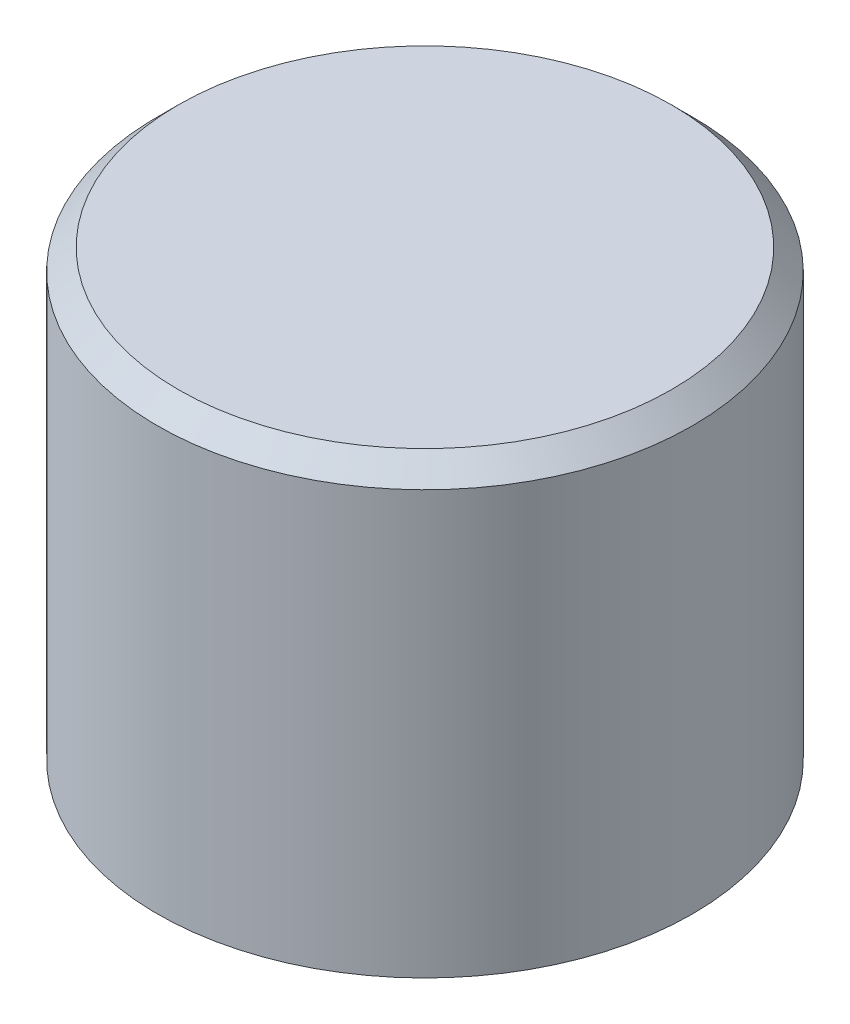
ISO-10303-21;
HEADER;
FILE_DESCRIPTION(('STEP AP214'),'2;1');
FILE_NAME('part.step','',(''),(''),'','','');
FILE_SCHEMA(('AUTOMOTIVE_DESIGN { 1 0 10303 214 1 1 1 1 }'));
ENDSEC;
DATA;
#1=APPLICATION_CONTEXT('core data for automotive mechanical design processes');
#2=APPLICATION_PROTOCOL_DEFINITION('international standard','automotive_design',2000,#1);
#3=PRODUCT_CONTEXT('',#1,'mechanical');
#4=PRODUCT('Part','Part','',(#3));
#5=PRODUCT_RELATED_PRODUCT_CATEGORY('part','',(#4));
#6=PRODUCT_DEFINITION_FORMATION('','',#4);
#7=PRODUCT_DEFINITION_CONTEXT('part definition',#1,'design');
#8=PRODUCT_DEFINITION('design','',#6,#7);
#9=PRODUCT_DEFINITION_SHAPE('','',#8);
#10=(LENGTH_UNIT() NAMED_UNIT(*) SI_UNIT(.MILLI.,.METRE.));
#11=(NAMED_UNIT(*) PLANE_ANGLE_UNIT() SI_UNIT($,.RADIAN.));
#12=(NAMED_UNIT(*) SI_UNIT($,.STERADIAN.) SOLID_ANGLE_UNIT());
#13=UNCERTAINTY_MEASURE_WITH_UNIT(LENGTH_MEASURE(1.E-05),#10,'distance_accuracy_value','');
#14=(GEOMETRIC_REPRESENTATION_CONTEXT(3) GLOBAL_UNCERTAINTY_ASSIGNED_CONTEXT((#13)) GLOBAL_UNIT_ASSIGNED_CONTEXT((#10,
#11,#12)) REPRESENTATION_CONTEXT('',''));
#15=CARTESIAN_POINT('',(0.,0.,0.));
#16=DIRECTION('',(0.,0.,1.));
#17=DIRECTION('',(1.,0.,0.));
#18=AXIS2_PLACEMENT_3D('',#15,#16,#17);
#19=CARTESIAN_POINT('',(-2.5,15.,0.));
#20=DIRECTION('',(0.,1.,0.));
#21=DIRECTION('',(-1.,0.,0.));
#22=AXIS2_PLACEMENT_3D('',#19,#20,#21);
#23=PLANE('',#22);
#24=CARTESIAN_POINT('',(0.,15.,0.));
#25=DIRECTION('',(0.,-1.,0.));
#26=DIRECTION('',(1.,0.,0.));
#27=AXIS2_PLACEMENT_3D('',#24,#25,#26);
#28=CIRCLE('',#27,2.5);
#29=CARTESIAN_POINT('',(2.5,15.,0.));
#30=VERTEX_POINT('',#29);
#31=EDGE_CURVE('E62',#30,#30,#28,.T.);
#32=ORIENTED_EDGE('',*,*,#31,.T.);
#33=EDGE_LOOP('',(#32));
#34=FACE_BOUND('',#33,.T.);
#35=ADVANCED_FACE('F35',(#34),#23,.F.);
#36=CARTESIAN_POINT('',(0.,17.,0.));
#37=DIRECTION('',(0.,-1.,0.));
#38=DIRECTION('',(1.,0.,0.));
#39=AXIS2_PLACEMENT_3D('',#36,#37,#38);
#40=PLANE('',#39);
#41=CARTESIAN_POINT('',(0.,17.,0.));
#42=DIRECTION('',(0.,-1.,0.));
#43=DIRECTION('',(1.,0.,0.));
#44=AXIS2_PLACEMENT_3D('',#41,#42,#43);
#45=CIRCLE('',#44,9.45);
#46=CARTESIAN_POINT('',(9.45,17.,0.));
#47=VERTEX_POINT('',#46);
#48=EDGE_CURVE('E10',#47,#47,#45,.F.);
#49=ORIENTED_EDGE('',*,*,#48,.T.);
#50=EDGE_LOOP('',(#49));
#51=FACE_BOUND('',#50,.T.);
#52=ADVANCED_FACE('F93',(#51),#40,.F.);
#53=CARTESIAN_POINT('',(0.,15.,0.));
#54=DIRECTION('',(0.,-1.,0.));
#55=DIRECTION('',(1.,0.,0.));
#56=AXIS2_PLACEMENT_3D('',#53,#54,#55);
#57=CYLINDRICAL_SURFACE('',#56,10.25);
#58=CARTESIAN_POINT('',(0.,16.2,0.));
#59=DIRECTION('',(0.,-1.,0.));
#60=DIRECTION('',(1.,0.,0.));
#61=AXIS2_PLACEMENT_3D('',#58,#59,#60);
#62=CIRCLE('',#61,10.25);
#63=CARTESIAN_POINT('',(10.25,16.2,0.));
#64=VERTEX_POINT('',#63);
#65=EDGE_CURVE('E43',#64,#64,#62,.T.);
#66=ORIENTED_EDGE('',*,*,#65,.T.);
#67=EDGE_LOOP('',(#66));
#68=FACE_BOUND('',#67,.T.);
#69=CARTESIAN_POINT('',(0.,0.,0.));
#70=DIRECTION('',(0.,-1.,0.));
#71=DIRECTION('',(1.,0.,0.));
#72=AXIS2_PLACEMENT_3D('',#69,#70,#71);
#73=CIRCLE('',#72,10.25);
#74=CARTESIAN_POINT('',(10.25,0.,0.));
#75=VERTEX_POINT('',#74);
#76=EDGE_CURVE('E47',#75,#75,#73,.T.);
#77=ORIENTED_EDGE('',*,*,#76,.F.);
#78=EDGE_LOOP('',(#77));
#79=FACE_BOUND('',#78,.T.);
#80=ADVANCED_FACE('F88',(#68,#79),#57,.T.);
#81=CARTESIAN_POINT('',(-10.25,0.,0.));
#82=DIRECTION('',(0.,1.,0.));
#83=DIRECTION('',(-1.,0.,0.));
#84=AXIS2_PLACEMENT_3D('',#81,#82,#83);
#85=PLANE('',#84);
#86=CARTESIAN_POINT('',(0.,0.,0.));
#87=DIRECTION('',(0.,-1.,0.));
#88=DIRECTION('',(1.,0.,0.));
#89=AXIS2_PLACEMENT_3D('',#86,#87,#88);
#90=CIRCLE('',#89,9.85);
#91=CARTESIAN_POINT('',(9.85,0.,0.));
#92=VERTEX_POINT('',#91);
#93=EDGE_CURVE('E51',#92,#92,#90,.T.);
#94=ORIENTED_EDGE('',*,*,#93,.F.);
#95=EDGE_LOOP('',(#94));
#96=FACE_BOUND('',#95,.T.);
#97=ORIENTED_EDGE('',*,*,#76,.T.);
#98=EDGE_LOOP('',(#97));
#99=FACE_BOUND('',#98,.T.);
#100=ADVANCED_FACE('F82',(#96,#99),#85,.F.);
#101=CARTESIAN_POINT('',(0.,15.,0.));
#102=DIRECTION('',(0.,-1.,0.));
#103=DIRECTION('',(1.,0.,0.));
#104=AXIS2_PLACEMENT_3D('',#101,#102,#103);
#105=CYLINDRICAL_SURFACE('',#104,9.85);
#106=CARTESIAN_POINT('',(0.,5.5,0.));
#107=DIRECTION('',(0.,-1.,0.));
#108=DIRECTION('',(1.,0.,0.));
#109=AXIS2_PLACEMENT_3D('',#106,#107,#108);
#110=CIRCLE('',#109,9.85);
#111=CARTESIAN_POINT('',(9.85,5.5,0.));
#112=VERTEX_POINT('',#111);
#113=EDGE_CURVE('E56',#112,#112,#110,.T.);
#114=ORIENTED_EDGE('',*,*,#113,.F.);
#115=EDGE_LOOP('',(#114));
#116=FACE_BOUND('',#115,.T.);
#117=ORIENTED_EDGE('',*,*,#93,.T.);
#118=EDGE_LOOP('',(#117));
#119=FACE_BOUND('',#118,.T.);
#120=ADVANCED_FACE('F76',(#116,#119),#105,.F.);
#121=CARTESIAN_POINT('',(-9.85,5.5,0.));
#122=DIRECTION('',(0.,1.,0.));
#123=DIRECTION('',(-1.,0.,0.));
#124=AXIS2_PLACEMENT_3D('',#121,#122,#123);
#125=PLANE('',#124);
#126=CARTESIAN_POINT('',(0.,5.5,0.));
#127=DIRECTION('',(0.,-1.,0.));
#128=DIRECTION('',(1.,0.,0.));
#129=AXIS2_PLACEMENT_3D('',#126,#127,#128);
#130=CIRCLE('',#129,2.5);
#131=CARTESIAN_POINT('',(2.5,5.5,0.));
#132=VERTEX_POINT('',#131);
#133=EDGE_CURVE('E59',#132,#132,#130,.T.);
#134=ORIENTED_EDGE('',*,*,#133,.F.);
#135=EDGE_LOOP('',(#134));
#136=FACE_BOUND('',#135,.T.);
#137=ORIENTED_EDGE('',*,*,#113,.T.);
#138=EDGE_LOOP('',(#137));
#139=FACE_BOUND('',#138,.T.);
#140=ADVANCED_FACE('F70',(#136,#139),#125,.F.);
#141=CARTESIAN_POINT('',(0.,15.,0.));
#142=DIRECTION('',(0.,-1.,0.));
#143=DIRECTION('',(1.,0.,0.));
#144=AXIS2_PLACEMENT_3D('',#141,#142,#143);
#145=CYLINDRICAL_SURFACE('',#144,2.5);
#146=ORIENTED_EDGE('',*,*,#31,.F.);
#147=EDGE_LOOP('',(#146));
#148=FACE_BOUND('',#147,.T.);
#149=ORIENTED_EDGE('',*,*,#133,.T.);
#150=EDGE_LOOP('',(#149));
#151=FACE_BOUND('',#150,.T.);
#152=ADVANCED_FACE('F67',(#148,#151),#145,.F.);
#153=CARTESIAN_POINT('',(0.,16.2,0.));
#154=DIRECTION('',(0.,-1.,0.));
#155=DIRECTION('',(1.,0.,0.));
#156=AXIS2_PLACEMENT_3D('',#153,#154,#155);
#157=CONICAL_SURFACE('',#156,10.25,0.78539816339745);
#158=ORIENTED_EDGE('',*,*,#48,.F.);
#159=EDGE_LOOP('',(#158));
#160=FACE_BOUND('',#159,.T.);
#161=ORIENTED_EDGE('',*,*,#65,.F.);
#162=EDGE_LOOP('',(#161));
#163=FACE_BOUND('',#162,.T.);
#164=ADVANCED_FACE('F38',(#160,#163),#157,.T.);
#165=CLOSED_SHELL('',(#35,#52,#80,#100,#120,#140,#152,#164));
#166=MANIFOLD_SOLID_BREP('B2',#165);
#167=ADVANCED_BREP_SHAPE_REPRESENTATION('',(#18,#166),#14);
#168=SHAPE_DEFINITION_REPRESENTATION(#9,#167);
ENDSEC;
END-ISO-10303-21;
